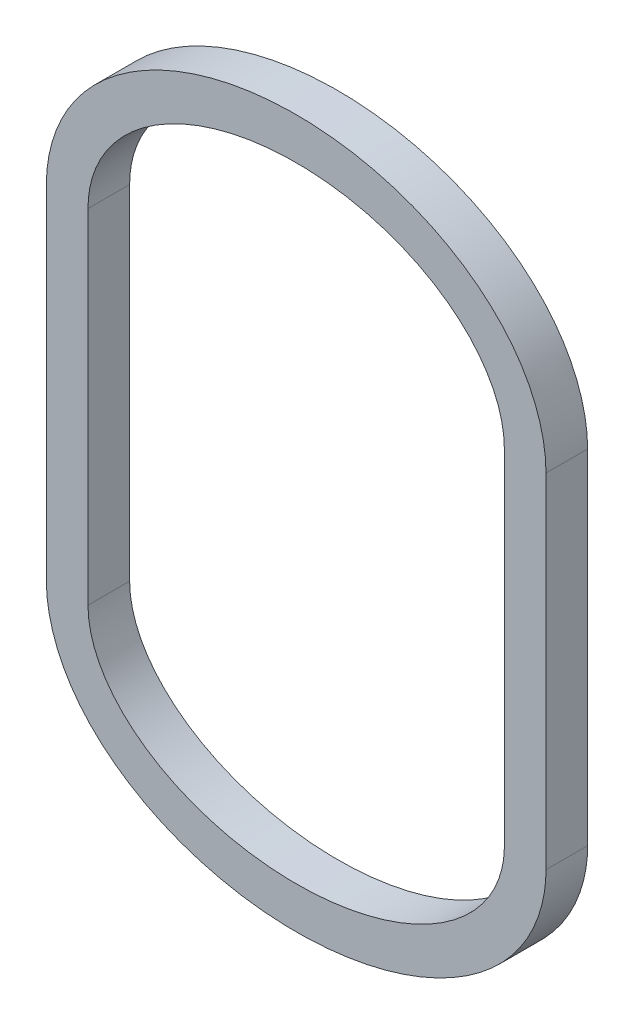
ISO-10303-21;
HEADER;
FILE_DESCRIPTION(('STEP AP214'),'2;1');
FILE_NAME('part.step','',(''),(''),'','','');
FILE_SCHEMA(('AUTOMOTIVE_DESIGN { 1 0 10303 214 1 1 1 1 }'));
ENDSEC;
DATA;
#1=APPLICATION_CONTEXT('core data for automotive mechanical design processes');
#2=APPLICATION_PROTOCOL_DEFINITION('international standard','automotive_design',2000,#1);
#3=PRODUCT_CONTEXT('',#1,'mechanical');
#4=PRODUCT('Part','Part','',(#3));
#5=PRODUCT_RELATED_PRODUCT_CATEGORY('part','',(#4));
#6=PRODUCT_DEFINITION_FORMATION('','',#4);
#7=PRODUCT_DEFINITION_CONTEXT('part definition',#1,'design');
#8=PRODUCT_DEFINITION('design','',#6,#7);
#9=PRODUCT_DEFINITION_SHAPE('','',#8);
#10=(LENGTH_UNIT() NAMED_UNIT(*) SI_UNIT(.MILLI.,.METRE.));
#11=(NAMED_UNIT(*) PLANE_ANGLE_UNIT() SI_UNIT($,.RADIAN.));
#12=(NAMED_UNIT(*) SI_UNIT($,.STERADIAN.) SOLID_ANGLE_UNIT());
#13=UNCERTAINTY_MEASURE_WITH_UNIT(LENGTH_MEASURE(1.E-05),#10,'distance_accuracy_value','');
#14=(GEOMETRIC_REPRESENTATION_CONTEXT(3) GLOBAL_UNCERTAINTY_ASSIGNED_CONTEXT((#13)) GLOBAL_UNIT_ASSIGNED_CONTEXT((#10,
#11,#12)) REPRESENTATION_CONTEXT('',''));
#15=CARTESIAN_POINT('',(0.,0.,0.));
#16=DIRECTION('',(0.,0.,1.));
#17=DIRECTION('',(1.,0.,0.));
#18=AXIS2_PLACEMENT_3D('',#15,#16,#17);
#19=CARTESIAN_POINT('',(10.,0.,2.));
#20=DIRECTION('',(-1.,0.,0.));
#21=DIRECTION('',(0.,0.,1.));
#22=AXIS2_PLACEMENT_3D('',#19,#20,#21);
#23=PLANE('',#22);
#24=DIRECTION('',(0.,1.,0.));
#25=VECTOR('',#24,1.);
#26=CARTESIAN_POINT('',(10.,0.,0.));
#27=LINE('',#26,#25);
#28=CARTESIAN_POINT('',(10.,-8.25,0.));
#29=VERTEX_POINT('',#28);
#30=CARTESIAN_POINT('',(10.,8.25,0.));
#31=VERTEX_POINT('',#30);
#32=EDGE_CURVE('E209',#29,#31,#27,.T.);
#33=ORIENTED_EDGE('',*,*,#32,.F.);
#34=DIRECTION('',(0.,0.,-1.));
#35=VECTOR('',#34,1.);
#36=CARTESIAN_POINT('',(10.,-8.25,2.));
#37=LINE('',#36,#35);
#38=CARTESIAN_POINT('',(10.,-8.25,2.));
#39=VERTEX_POINT('',#38);
#40=EDGE_CURVE('E11',#39,#29,#37,.T.);
#41=ORIENTED_EDGE('',*,*,#40,.F.);
#42=DIRECTION('',(0.,1.,0.));
#43=VECTOR('',#42,1.);
#44=CARTESIAN_POINT('',(10.,0.,2.));
#45=LINE('',#44,#43);
#46=CARTESIAN_POINT('',(10.,8.25,2.));
#47=VERTEX_POINT('',#46);
#48=EDGE_CURVE('E124',#39,#47,#45,.T.);
#49=ORIENTED_EDGE('',*,*,#48,.T.);
#50=DIRECTION('',(0.,0.,-1.));
#51=VECTOR('',#50,1.);
#52=CARTESIAN_POINT('',(10.,8.25,2.));
#53=LINE('',#52,#51);
#54=EDGE_CURVE('E55',#47,#31,#53,.T.);
#55=ORIENTED_EDGE('',*,*,#54,.T.);
#56=EDGE_LOOP('',(#33,#41,#49,#55));
#57=FACE_BOUND('',#56,.T.);
#58=ADVANCED_FACE('F35',(#57),#23,.T.);
#59=CARTESIAN_POINT('',(0.,-8.25,2.));
#60=DIRECTION('',(0.,0.,1.));
#61=DIRECTION('',(-1.,0.,0.));
#62=AXIS2_PLACEMENT_3D('',#59,#60,#61);
#63=ELLIPSE('',#62,10.,6.58964474913742);
#64=DIRECTION('',(0.,0.,-1.));
#65=VECTOR('',#64,1.);
#66=SURFACE_OF_LINEAR_EXTRUSION('',#63,#65);
#67=CARTESIAN_POINT('',(0.,-8.25,0.));
#68=DIRECTION('',(0.,0.,1.));
#69=DIRECTION('',(-1.,0.,0.));
#70=AXIS2_PLACEMENT_3D('',#67,#68,#69);
#71=ELLIPSE('',#70,10.,6.58964474913742);
#72=CARTESIAN_POINT('',(-10.,-8.25,0.));
#73=VERTEX_POINT('',#72);
#74=EDGE_CURVE('E113',#73,#29,#71,.T.);
#75=ORIENTED_EDGE('',*,*,#74,.F.);
#76=DIRECTION('',(0.,0.,-1.));
#77=VECTOR('',#76,1.);
#78=CARTESIAN_POINT('',(-10.,-8.25,2.));
#79=LINE('',#78,#77);
#80=CARTESIAN_POINT('',(-10.,-8.25,2.));
#81=VERTEX_POINT('',#80);
#82=EDGE_CURVE('E46',#81,#73,#79,.T.);
#83=ORIENTED_EDGE('',*,*,#82,.F.);
#84=EDGE_CURVE('E111',#81,#39,#63,.T.);
#85=ORIENTED_EDGE('',*,*,#84,.T.);
#86=ORIENTED_EDGE('',*,*,#40,.T.);
#87=EDGE_LOOP('',(#75,#83,#85,#86));
#88=FACE_BOUND('',#87,.T.);
#89=ADVANCED_FACE('F110',(#88),#66,.T.);
#90=CARTESIAN_POINT('',(-10.,0.,2.));
#91=DIRECTION('',(1.,0.,0.));
#92=DIRECTION('',(0.,0.,-1.));
#93=AXIS2_PLACEMENT_3D('',#90,#91,#92);
#94=PLANE('',#93);
#95=DIRECTION('',(0.,-1.,0.));
#96=VECTOR('',#95,1.);
#97=CARTESIAN_POINT('',(-10.,0.,0.));
#98=LINE('',#97,#96);
#99=CARTESIAN_POINT('',(-10.,8.25,0.));
#100=VERTEX_POINT('',#99);
#101=EDGE_CURVE('E175',#100,#73,#98,.T.);
#102=ORIENTED_EDGE('',*,*,#101,.F.);
#103=DIRECTION('',(0.,0.,-1.));
#104=VECTOR('',#103,1.);
#105=CARTESIAN_POINT('',(-10.,8.25,2.));
#106=LINE('',#105,#104);
#107=CARTESIAN_POINT('',(-10.,8.25,2.));
#108=VERTEX_POINT('',#107);
#109=EDGE_CURVE('E80',#108,#100,#106,.T.);
#110=ORIENTED_EDGE('',*,*,#109,.F.);
#111=DIRECTION('',(0.,-1.,0.));
#112=VECTOR('',#111,1.);
#113=CARTESIAN_POINT('',(-10.,0.,2.));
#114=LINE('',#113,#112);
#115=EDGE_CURVE('E123',#108,#81,#114,.T.);
#116=ORIENTED_EDGE('',*,*,#115,.T.);
#117=ORIENTED_EDGE('',*,*,#82,.T.);
#118=EDGE_LOOP('',(#102,#110,#116,#117));
#119=FACE_BOUND('',#118,.T.);
#120=ADVANCED_FACE('F126',(#119),#94,.T.);
#121=CARTESIAN_POINT('',(-12.,-8.25,2.));
#122=CARTESIAN_POINT('',(-12.,-9.50096149899138,2.));
#123=CARTESIAN_POINT('',(-11.2142081610172,-12.0028844969741,2.));
#124=CARTESIAN_POINT('',(-8.34263112239485,-14.7550886840937,2.));
#125=CARTESIAN_POINT('',(-4.44455132811694,-16.4543362267607,2.));
#126=CARTESIAN_POINT('',(0.,-17.0322990103258,2.));
#127=CARTESIAN_POINT('',(4.44455132811693,-16.4543362267607,2.));
#128=CARTESIAN_POINT('',(8.34263112239484,-14.7550886840937,2.));
#129=CARTESIAN_POINT('',(11.2142081610172,-12.0028844969741,2.));
#130=CARTESIAN_POINT('',(12.3928959194914,-8.25,2.));
#131=CARTESIAN_POINT('',(11.2142081610172,-4.49711550302586,2.));
#132=CARTESIAN_POINT('',(8.34263112239485,-1.74491131590634,2.));
#133=CARTESIAN_POINT('',(4.44455132811694,-0.0456637732392793,2.));
#134=CARTESIAN_POINT('',(0.,0.532299010325764,2.));
#135=CARTESIAN_POINT('',(-4.44455132811693,-0.0456637732392742,2.));
#136=CARTESIAN_POINT('',(-8.34263112239484,-1.74491131590633,2.));
#137=CARTESIAN_POINT('',(-11.2142081610172,-4.49711550302585,2.));
#138=CARTESIAN_POINT('',(-12.,-6.99903850100861,2.));
#139=CARTESIAN_POINT('',(-12.,-8.25,2.));
#140=B_SPLINE_CURVE_WITH_KNOTS('',3,(#121,#122,#123,#124,#125,#126,#127,#128,#129,#130,#131,
#132,#133,#134,#135,#136,#137,#138,#139),.UNSPECIFIED.,.T.,.F.,(4,1,1,1,1,1,1,1,1,1,1,1,1,1,1,1,
4),(0.,0.392699081698724,0.785398163397448,1.17809724509617,1.5707963267949,1.96349540849362,
2.35619449019234,2.74889357189107,3.14159265358979,3.53429173528852,3.92699081698724,
4.31968989868597,4.71238898038469,5.10508806208341,5.49778714378214,5.89048622548086,
6.28318530717959),.UNSPECIFIED.);
#141=DIRECTION('',(0.,0.,-1.));
#142=VECTOR('',#141,1.);
#143=SURFACE_OF_LINEAR_EXTRUSION('',#140,#142);
#144=CARTESIAN_POINT('',(-12.,-8.25,0.));
#145=CARTESIAN_POINT('',(-12.,-9.50096149899138,0.));
#146=CARTESIAN_POINT('',(-11.2142081610172,-12.0028844969741,0.));
#147=CARTESIAN_POINT('',(-8.34263112239485,-14.7550886840937,0.));
#148=CARTESIAN_POINT('',(-4.44455132811694,-16.4543362267607,0.));
#149=CARTESIAN_POINT('',(0.,-17.0322990103258,0.));
#150=CARTESIAN_POINT('',(4.44455132811693,-16.4543362267607,0.));
#151=CARTESIAN_POINT('',(8.34263112239484,-14.7550886840937,0.));
#152=CARTESIAN_POINT('',(11.2142081610172,-12.0028844969741,0.));
#153=CARTESIAN_POINT('',(12.3928959194914,-8.25,0.));
#154=CARTESIAN_POINT('',(11.2142081610172,-4.49711550302586,0.));
#155=CARTESIAN_POINT('',(8.34263112239485,-1.74491131590634,0.));
#156=CARTESIAN_POINT('',(4.44455132811694,-0.0456637732392793,0.));
#157=CARTESIAN_POINT('',(0.,0.532299010325764,0.));
#158=CARTESIAN_POINT('',(-4.44455132811693,-0.0456637732392742,0.));
#159=CARTESIAN_POINT('',(-8.34263112239484,-1.74491131590633,0.));
#160=CARTESIAN_POINT('',(-11.2142081610172,-4.49711550302585,0.));
#161=CARTESIAN_POINT('',(-12.,-6.99903850100861,0.));
#162=CARTESIAN_POINT('',(-12.,-8.25,0.));
#163=B_SPLINE_CURVE_WITH_KNOTS('',3,(#144,#145,#146,#147,#148,#149,#150,#151,#152,#153,#154,
#155,#156,#157,#158,#159,#160,#161,#162),.UNSPECIFIED.,.T.,.F.,(4,1,1,1,1,1,1,1,1,1,1,1,1,1,1,1,
4),(0.,0.392699081698724,0.785398163397448,1.17809724509617,1.5707963267949,1.96349540849362,
2.35619449019234,2.74889357189107,3.14159265358979,3.53429173528852,3.92699081698724,
4.31968989868597,4.71238898038469,5.10508806208341,5.49778714378214,5.89048622548086,
6.28318530717959),.UNSPECIFIED.);
#164=CARTESIAN_POINT('',(-12.,-8.25,0.));
#165=VERTEX_POINT('',#164);
#166=CARTESIAN_POINT('',(12.,-8.24999999999963,0.));
#167=VERTEX_POINT('',#166);
#168=EDGE_CURVE('E135',#165,#167,#163,.T.);
#169=ORIENTED_EDGE('',*,*,#168,.T.);
#170=DIRECTION('',(0.,0.,-1.));
#171=VECTOR('',#170,1.);
#172=CARTESIAN_POINT('',(12.,-8.24999999999963,2.));
#173=LINE('',#172,#171);
#174=CARTESIAN_POINT('',(12.,-8.24999999999963,2.));
#175=VERTEX_POINT('',#174);
#176=EDGE_CURVE('E40',#175,#167,#173,.T.);
#177=ORIENTED_EDGE('',*,*,#176,.F.);
#178=CARTESIAN_POINT('',(-12.,-8.25,2.));
#179=VERTEX_POINT('',#178);
#180=EDGE_CURVE('E174',#179,#175,#140,.T.);
#181=ORIENTED_EDGE('',*,*,#180,.F.);
#182=DIRECTION('',(0.,0.,-1.));
#183=VECTOR('',#182,1.);
#184=CARTESIAN_POINT('',(-12.,-8.25,2.));
#185=LINE('',#184,#183);
#186=EDGE_CURVE('E129',#179,#165,#185,.T.);
#187=ORIENTED_EDGE('',*,*,#186,.T.);
#188=EDGE_LOOP('',(#169,#177,#181,#187));
#189=FACE_BOUND('',#188,.T.);
#190=ADVANCED_FACE('F37',(#189),#143,.F.);
#191=CARTESIAN_POINT('',(12.,0.,2.));
#192=DIRECTION('',(-1.,0.,0.));
#193=DIRECTION('',(0.,0.,1.));
#194=AXIS2_PLACEMENT_3D('',#191,#192,#193);
#195=PLANE('',#194);
#196=DIRECTION('',(0.,1.,0.));
#197=VECTOR('',#196,1.);
#198=CARTESIAN_POINT('',(12.,0.,0.));
#199=LINE('',#198,#197);
#200=CARTESIAN_POINT('',(12.,8.24999999999968,0.));
#201=VERTEX_POINT('',#200);
#202=EDGE_CURVE('E192',#167,#201,#199,.T.);
#203=ORIENTED_EDGE('',*,*,#202,.T.);
#204=DIRECTION('',(0.,0.,-1.));
#205=VECTOR('',#204,1.);
#206=CARTESIAN_POINT('',(12.,8.24999999999968,2.));
#207=LINE('',#206,#205);
#208=CARTESIAN_POINT('',(12.,8.24999999999968,2.));
#209=VERTEX_POINT('',#208);
#210=EDGE_CURVE('E186',#209,#201,#207,.T.);
#211=ORIENTED_EDGE('',*,*,#210,.F.);
#212=DIRECTION('',(0.,1.,0.));
#213=VECTOR('',#212,1.);
#214=CARTESIAN_POINT('',(12.,0.,2.));
#215=LINE('',#214,#213);
#216=EDGE_CURVE('E93',#175,#209,#215,.T.);
#217=ORIENTED_EDGE('',*,*,#216,.F.);
#218=ORIENTED_EDGE('',*,*,#176,.T.);
#219=EDGE_LOOP('',(#203,#211,#217,#218));
#220=FACE_BOUND('',#219,.T.);
#221=ADVANCED_FACE('F159',(#220),#195,.F.);
#222=CARTESIAN_POINT('',(-12.,8.25,2.));
#223=CARTESIAN_POINT('',(-12.,6.97313674676951,2.));
#224=CARTESIAN_POINT('',(-11.2402056103029,4.41941024030854,2.));
#225=CARTESIAN_POINT('',(-8.38464582985468,1.53600538360335,2.));
#226=CARTESIAN_POINT('',(-4.46964523121026,-0.253766413456371,2.));
#227=CARTESIAN_POINT('',(0.,-0.863649669565682,2.));
#228=CARTESIAN_POINT('',(4.46964523121025,-0.253766413456372,2.));
#229=CARTESIAN_POINT('',(8.38464582985468,1.53600538360335,2.));
#230=CARTESIAN_POINT('',(11.2402056103029,4.41941024030854,2.));
#231=CARTESIAN_POINT('',(12.3798971948485,8.25,2.));
#232=CARTESIAN_POINT('',(11.2402056103029,12.0805897596915,2.));
#233=CARTESIAN_POINT('',(8.38464582985469,14.9639946163967,2.));
#234=CARTESIAN_POINT('',(4.46964523121026,16.7537664134564,2.));
#235=CARTESIAN_POINT('',(0.,17.3636496695657,2.));
#236=CARTESIAN_POINT('',(-4.46964523121026,16.7537664134564,2.));
#237=CARTESIAN_POINT('',(-8.38464582985468,14.9639946163967,2.));
#238=CARTESIAN_POINT('',(-11.2402056103029,12.0805897596915,2.));
#239=CARTESIAN_POINT('',(-12.,9.52686325323049,2.));
#240=CARTESIAN_POINT('',(-12.,8.25,2.));
#241=B_SPLINE_CURVE_WITH_KNOTS('',3,(#222,#223,#224,#225,#226,#227,#228,#229,#230,#231,#232,
#233,#234,#235,#236,#237,#238,#239,#240),.UNSPECIFIED.,.T.,.F.,(4,1,1,1,1,1,1,1,1,1,1,1,1,1,1,1,
4),(0.,0.392699081698724,0.785398163397448,1.17809724509617,1.5707963267949,1.96349540849362,
2.35619449019234,2.74889357189107,3.14159265358979,3.53429173528852,3.92699081698724,
4.31968989868597,4.71238898038469,5.10508806208341,5.49778714378214,5.89048622548086,
6.28318530717959),.UNSPECIFIED.);
#242=DIRECTION('',(0.,0.,-1.));
#243=VECTOR('',#242,1.);
#244=SURFACE_OF_LINEAR_EXTRUSION('',#241,#243);
#245=CARTESIAN_POINT('',(-12.,8.25,0.));
#246=CARTESIAN_POINT('',(-12.,6.97313674676951,0.));
#247=CARTESIAN_POINT('',(-11.2402056103029,4.41941024030854,0.));
#248=CARTESIAN_POINT('',(-8.38464582985468,1.53600538360335,0.));
#249=CARTESIAN_POINT('',(-4.46964523121026,-0.253766413456371,0.));
#250=CARTESIAN_POINT('',(0.,-0.863649669565682,0.));
#251=CARTESIAN_POINT('',(4.46964523121025,-0.253766413456372,0.));
#252=CARTESIAN_POINT('',(8.38464582985468,1.53600538360335,0.));
#253=CARTESIAN_POINT('',(11.2402056103029,4.41941024030854,0.));
#254=CARTESIAN_POINT('',(12.3798971948485,8.25,0.));
#255=CARTESIAN_POINT('',(11.2402056103029,12.0805897596915,0.));
#256=CARTESIAN_POINT('',(8.38464582985469,14.9639946163967,0.));
#257=CARTESIAN_POINT('',(4.46964523121026,16.7537664134564,0.));
#258=CARTESIAN_POINT('',(0.,17.3636496695657,0.));
#259=CARTESIAN_POINT('',(-4.46964523121026,16.7537664134564,0.));
#260=CARTESIAN_POINT('',(-8.38464582985468,14.9639946163967,0.));
#261=CARTESIAN_POINT('',(-11.2402056103029,12.0805897596915,0.));
#262=CARTESIAN_POINT('',(-12.,9.52686325323049,0.));
#263=CARTESIAN_POINT('',(-12.,8.25,0.));
#264=B_SPLINE_CURVE_WITH_KNOTS('',3,(#245,#246,#247,#248,#249,#250,#251,#252,#253,#254,#255,
#256,#257,#258,#259,#260,#261,#262,#263),.UNSPECIFIED.,.T.,.F.,(4,1,1,1,1,1,1,1,1,1,1,1,1,1,1,1,
4),(0.,0.392699081698724,0.785398163397448,1.17809724509617,1.5707963267949,1.96349540849362,
2.35619449019234,2.74889357189107,3.14159265358979,3.53429173528852,3.92699081698724,
4.31968989868597,4.71238898038469,5.10508806208341,5.49778714378214,5.89048622548086,
6.28318530717959),.UNSPECIFIED.);
#265=CARTESIAN_POINT('',(-12.,8.25,0.));
#266=VERTEX_POINT('',#265);
#267=EDGE_CURVE('E199',#201,#266,#264,.T.);
#268=ORIENTED_EDGE('',*,*,#267,.T.);
#269=DIRECTION('',(0.,0.,-1.));
#270=VECTOR('',#269,1.);
#271=CARTESIAN_POINT('',(-12.,8.25,2.));
#272=LINE('',#271,#270);
#273=CARTESIAN_POINT('',(-12.,8.25,2.));
#274=VERTEX_POINT('',#273);
#275=EDGE_CURVE('E184',#274,#266,#272,.T.);
#276=ORIENTED_EDGE('',*,*,#275,.F.);
#277=EDGE_CURVE('E161',#209,#274,#241,.T.);
#278=ORIENTED_EDGE('',*,*,#277,.F.);
#279=ORIENTED_EDGE('',*,*,#210,.T.);
#280=EDGE_LOOP('',(#268,#276,#278,#279));
#281=FACE_BOUND('',#280,.T.);
#282=ADVANCED_FACE('F155',(#281),#244,.F.);
#283=CARTESIAN_POINT('',(-12.,0.,2.));
#284=DIRECTION('',(1.,0.,0.));
#285=DIRECTION('',(0.,0.,-1.));
#286=AXIS2_PLACEMENT_3D('',#283,#284,#285);
#287=PLANE('',#286);
#288=DIRECTION('',(0.,-1.,0.));
#289=VECTOR('',#288,1.);
#290=CARTESIAN_POINT('',(-12.,0.,0.));
#291=LINE('',#290,#289);
#292=EDGE_CURVE('E200',#266,#165,#291,.T.);
#293=ORIENTED_EDGE('',*,*,#292,.T.);
#294=ORIENTED_EDGE('',*,*,#186,.F.);
#295=DIRECTION('',(0.,-1.,0.));
#296=VECTOR('',#295,1.);
#297=CARTESIAN_POINT('',(-12.,0.,2.));
#298=LINE('',#297,#296);
#299=EDGE_CURVE('E167',#274,#179,#298,.T.);
#300=ORIENTED_EDGE('',*,*,#299,.F.);
#301=ORIENTED_EDGE('',*,*,#275,.T.);
#302=EDGE_LOOP('',(#293,#294,#300,#301));
#303=FACE_BOUND('',#302,.T.);
#304=ADVANCED_FACE('F144',(#303),#287,.F.);
#305=CARTESIAN_POINT('',(0.,8.25,2.));
#306=DIRECTION('',(0.,0.,1.));
#307=DIRECTION('',(-1.,0.,0.));
#308=AXIS2_PLACEMENT_3D('',#305,#306,#307);
#309=ELLIPSE('',#308,10.,6.91035525086258);
#310=DIRECTION('',(0.,0.,-1.));
#311=VECTOR('',#310,1.);
#312=SURFACE_OF_LINEAR_EXTRUSION('',#309,#311);
#313=CARTESIAN_POINT('',(0.,8.25,0.));
#314=DIRECTION('',(0.,0.,1.));
#315=DIRECTION('',(-1.,0.,0.));
#316=AXIS2_PLACEMENT_3D('',#313,#314,#315);
#317=ELLIPSE('',#316,10.,6.91035525086258);
#318=EDGE_CURVE('E172',#31,#100,#317,.T.);
#319=ORIENTED_EDGE('',*,*,#318,.F.);
#320=ORIENTED_EDGE('',*,*,#54,.F.);
#321=EDGE_CURVE('E127',#47,#108,#309,.T.);
#322=ORIENTED_EDGE('',*,*,#321,.T.);
#323=ORIENTED_EDGE('',*,*,#109,.T.);
#324=EDGE_LOOP('',(#319,#320,#322,#323));
#325=FACE_BOUND('',#324,.T.);
#326=ADVANCED_FACE('F140',(#325),#312,.T.);
#327=CARTESIAN_POINT('',(0.,0.,2.));
#328=DIRECTION('',(0.,0.,1.));
#329=DIRECTION('',(1.,0.,0.));
#330=AXIS2_PLACEMENT_3D('',#327,#328,#329);
#331=PLANE('',#330);
#332=ORIENTED_EDGE('',*,*,#180,.T.);
#333=ORIENTED_EDGE('',*,*,#216,.T.);
#334=ORIENTED_EDGE('',*,*,#277,.T.);
#335=ORIENTED_EDGE('',*,*,#299,.T.);
#336=EDGE_LOOP('',(#332,#333,#334,#335));
#337=FACE_BOUND('',#336,.T.);
#338=ORIENTED_EDGE('',*,*,#48,.F.);
#339=ORIENTED_EDGE('',*,*,#84,.F.);
#340=ORIENTED_EDGE('',*,*,#115,.F.);
#341=ORIENTED_EDGE('',*,*,#321,.F.);
#342=EDGE_LOOP('',(#338,#339,#340,#341));
#343=FACE_BOUND('',#342,.T.);
#344=ADVANCED_FACE('F121',(#337,#343),#331,.T.);
#345=CARTESIAN_POINT('',(0.,0.,0.));
#346=DIRECTION('',(0.,0.,1.));
#347=DIRECTION('',(1.,0.,0.));
#348=AXIS2_PLACEMENT_3D('',#345,#346,#347);
#349=PLANE('',#348);
#350=ORIENTED_EDGE('',*,*,#168,.F.);
#351=ORIENTED_EDGE('',*,*,#292,.F.);
#352=ORIENTED_EDGE('',*,*,#267,.F.);
#353=ORIENTED_EDGE('',*,*,#202,.F.);
#354=EDGE_LOOP('',(#350,#351,#352,#353));
#355=FACE_BOUND('',#354,.T.);
#356=ORIENTED_EDGE('',*,*,#32,.T.);
#357=ORIENTED_EDGE('',*,*,#318,.T.);
#358=ORIENTED_EDGE('',*,*,#101,.T.);
#359=ORIENTED_EDGE('',*,*,#74,.T.);
#360=EDGE_LOOP('',(#356,#357,#358,#359));
#361=FACE_BOUND('',#360,.T.);
#362=ADVANCED_FACE('F145',(#355,#361),#349,.F.);
#363=CLOSED_SHELL('',(#58,#89,#120,#190,#221,#282,#304,#326,#344,#362));
#364=MANIFOLD_SOLID_BREP('B2',#363);
#365=ADVANCED_BREP_SHAPE_REPRESENTATION('',(#18,#364),#14);
#366=SHAPE_DEFINITION_REPRESENTATION(#9,#365);
ENDSEC;
END-ISO-10303-21;
